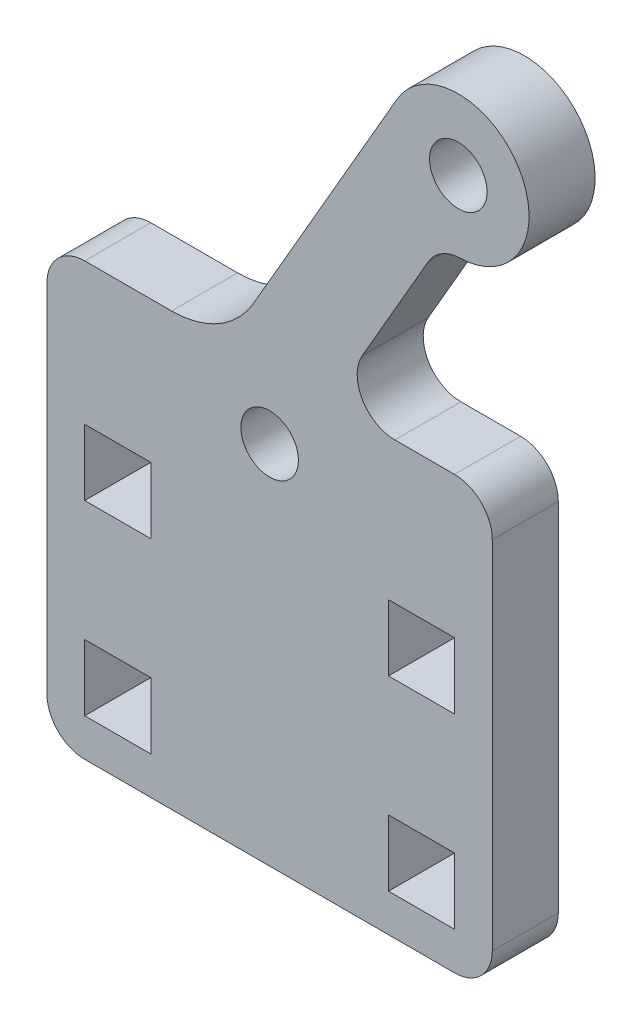
ISO-10303-21;
HEADER;
FILE_DESCRIPTION(('STEP AP214'),'2;1');
FILE_NAME('part.step','',(''),(''),'','','');
FILE_SCHEMA(('AUTOMOTIVE_DESIGN { 1 0 10303 214 1 1 1 1 }'));
ENDSEC;
DATA;
#1=APPLICATION_CONTEXT('core data for automotive mechanical design processes');
#2=APPLICATION_PROTOCOL_DEFINITION('international standard','automotive_design',2000,#1);
#3=PRODUCT_CONTEXT('',#1,'mechanical');
#4=PRODUCT('Part','Part','',(#3));
#5=PRODUCT_RELATED_PRODUCT_CATEGORY('part','',(#4));
#6=PRODUCT_DEFINITION_FORMATION('','',#4);
#7=PRODUCT_DEFINITION_CONTEXT('part definition',#1,'design');
#8=PRODUCT_DEFINITION('design','',#6,#7);
#9=PRODUCT_DEFINITION_SHAPE('','',#8);
#10=(LENGTH_UNIT() NAMED_UNIT(*) SI_UNIT(.MILLI.,.METRE.));
#11=(NAMED_UNIT(*) PLANE_ANGLE_UNIT() SI_UNIT($,.RADIAN.));
#12=(NAMED_UNIT(*) SI_UNIT($,.STERADIAN.) SOLID_ANGLE_UNIT());
#13=UNCERTAINTY_MEASURE_WITH_UNIT(LENGTH_MEASURE(1.E-05),#10,'distance_accuracy_value','');
#14=(GEOMETRIC_REPRESENTATION_CONTEXT(3) GLOBAL_UNCERTAINTY_ASSIGNED_CONTEXT((#13)) GLOBAL_UNIT_ASSIGNED_CONTEXT((#10,
#11,#12)) REPRESENTATION_CONTEXT('',''));
#15=CARTESIAN_POINT('',(0.,0.,0.));
#16=DIRECTION('',(0.,0.,1.));
#17=DIRECTION('',(1.,0.,0.));
#18=AXIS2_PLACEMENT_3D('',#15,#16,#17);
#19=CARTESIAN_POINT('',(10.,36.7005080756888,3.5));
#20=DIRECTION('',(0.,0.,1.));
#21=DIRECTION('',(1.,0.,0.));
#22=AXIS2_PLACEMENT_3D('',#19,#20,#21);
#23=PLANE('',#22);
#24=CARTESIAN_POINT('',(0.,19.38,3.5));
#25=DIRECTION('',(0.,0.,1.));
#26=DIRECTION('',(1.,0.,0.));
#27=AXIS2_PLACEMENT_3D('',#24,#25,#26);
#28=CIRCLE('',#27,1.525);
#29=CARTESIAN_POINT('',(1.525,19.38,3.5));
#30=VERTEX_POINT('',#29);
#31=EDGE_CURVE('E269',#30,#30,#28,.T.);
#32=ORIENTED_EDGE('',*,*,#31,.F.);
#33=EDGE_LOOP('',(#32));
#34=FACE_BOUND('',#33,.T.);
#35=DIRECTION('',(0.,-1.,0.));
#36=VECTOR('',#35,1.);
#37=CARTESIAN_POINT('',(-11.8,0.,3.5));
#38=LINE('',#37,#36);
#39=CARTESIAN_POINT('',(-11.8,20.88,3.5));
#40=VERTEX_POINT('',#39);
#41=CARTESIAN_POINT('',(-11.8,2.,3.5));
#42=VERTEX_POINT('',#41);
#43=EDGE_CURVE('E373',#40,#42,#38,.T.);
#44=ORIENTED_EDGE('',*,*,#43,.T.);
#45=CARTESIAN_POINT('',(-9.8,2.,3.5));
#46=DIRECTION('',(0.,0.,1.));
#47=DIRECTION('',(1.,0.,0.));
#48=AXIS2_PLACEMENT_3D('',#45,#46,#47);
#49=CIRCLE('',#48,2.);
#50=CARTESIAN_POINT('',(-9.8,0.,3.5));
#51=VERTEX_POINT('',#50);
#52=EDGE_CURVE('E442',#42,#51,#49,.T.);
#53=ORIENTED_EDGE('',*,*,#52,.T.);
#54=DIRECTION('',(1.,0.,0.));
#55=VECTOR('',#54,1.);
#56=CARTESIAN_POINT('',(-11.8,0.,3.5));
#57=LINE('',#56,#55);
#58=CARTESIAN_POINT('',(9.8,0.,3.5));
#59=VERTEX_POINT('',#58);
#60=EDGE_CURVE('E376',#51,#59,#57,.T.);
#61=ORIENTED_EDGE('',*,*,#60,.T.);
#62=CARTESIAN_POINT('',(9.8,2.,3.5));
#63=DIRECTION('',(0.,0.,1.));
#64=DIRECTION('',(1.,0.,0.));
#65=AXIS2_PLACEMENT_3D('',#62,#63,#64);
#66=CIRCLE('',#65,2.);
#67=CARTESIAN_POINT('',(11.8,2.,3.5));
#68=VERTEX_POINT('',#67);
#69=EDGE_CURVE('E438',#59,#68,#66,.T.);
#70=ORIENTED_EDGE('',*,*,#69,.T.);
#71=DIRECTION('',(0.,1.,0.));
#72=VECTOR('',#71,1.);
#73=CARTESIAN_POINT('',(11.8,0.,3.5));
#74=LINE('',#73,#72);
#75=CARTESIAN_POINT('',(11.8,20.88,3.5));
#76=VERTEX_POINT('',#75);
#77=EDGE_CURVE('E380',#68,#76,#74,.T.);
#78=ORIENTED_EDGE('',*,*,#77,.T.);
#79=CARTESIAN_POINT('',(9.8,20.88,3.5));
#80=DIRECTION('',(0.,0.,1.));
#81=DIRECTION('',(1.,0.,0.));
#82=AXIS2_PLACEMENT_3D('',#79,#80,#81);
#83=CIRCLE('',#82,2.);
#84=CARTESIAN_POINT('',(9.8,22.88,3.5));
#85=VERTEX_POINT('',#84);
#86=EDGE_CURVE('E436',#76,#85,#83,.T.);
#87=ORIENTED_EDGE('',*,*,#86,.T.);
#88=DIRECTION('',(-1.,0.,0.));
#89=VECTOR('',#88,1.);
#90=CARTESIAN_POINT('',(3.17542648054294,22.88,3.5));
#91=LINE('',#90,#89);
#92=CARTESIAN_POINT('',(6.6395280956807,22.88,3.5));
#93=VERTEX_POINT('',#92);
#94=EDGE_CURVE('E383',#85,#93,#91,.T.);
#95=ORIENTED_EDGE('',*,*,#94,.T.);
#96=CARTESIAN_POINT('',(6.6395280956807,24.88,3.5));
#97=DIRECTION('',(0.,0.,1.));
#98=DIRECTION('',(1.,0.,0.));
#99=AXIS2_PLACEMENT_3D('',#96,#97,#98);
#100=CIRCLE('',#99,2.);
#101=CARTESIAN_POINT('',(4.90747728811182,25.88,3.5));
#102=VERTEX_POINT('',#101);
#103=EDGE_CURVE('E467',#93,#102,#100,.F.);
#104=ORIENTED_EDGE('',*,*,#103,.T.);
#105=DIRECTION('',(0.5,0.866025403784439,0.));
#106=VECTOR('',#105,1.);
#107=CARTESIAN_POINT('',(9.05892136693432,33.0705120693016,3.5));
#108=LINE('',#107,#106);
#109=CARTESIAN_POINT('',(8.41334829499086,31.9523467086972,3.5));
#110=VERTEX_POINT('',#109);
#111=EDGE_CURVE('E386',#102,#110,#108,.T.);
#112=ORIENTED_EDGE('',*,*,#111,.T.);
#113=CARTESIAN_POINT('',(10.1453991025597,30.9523467086972,3.5));
#114=DIRECTION('',(0.,0.,1.));
#115=DIRECTION('',(1.,0.,0.));
#116=AXIS2_PLACEMENT_3D('',#113,#114,#115);
#117=CIRCLE('',#116,2.);
#118=CARTESIAN_POINT('',(10.0948255016694,32.9517071841725,3.5));
#119=VERTEX_POINT('',#118);
#120=EDGE_CURVE('E471',#110,#119,#117,.F.);
#121=ORIENTED_EDGE('',*,*,#120,.T.);
#122=CARTESIAN_POINT('',(10.,36.7005080756888,3.5));
#123=DIRECTION('',(0.,0.,1.));
#124=DIRECTION('',(1.,0.,0.));
#125=AXIS2_PLACEMENT_3D('',#122,#123,#124);
#126=CIRCLE('',#125,3.75);
#127=CARTESIAN_POINT('',(6.75240473580835,38.5755080756888,3.5));
#128=VERTEX_POINT('',#127);
#129=EDGE_CURVE('E389',#119,#128,#126,.T.);
#130=ORIENTED_EDGE('',*,*,#129,.T.);
#131=DIRECTION('',(-0.5,-0.866025403784439,0.));
#132=VECTOR('',#131,1.);
#133=CARTESIAN_POINT('',(-2.30940107675851,22.88,3.5));
#134=LINE('',#133,#132);
#135=CARTESIAN_POINT('',(-0.86602540378444,25.38,3.5));
#136=VERTEX_POINT('',#135);
#137=EDGE_CURVE('E391',#128,#136,#134,.T.);
#138=ORIENTED_EDGE('',*,*,#137,.T.);
#139=CARTESIAN_POINT('',(-5.19615242270663,27.88,3.5));
#140=DIRECTION('',(0.,0.,1.));
#141=DIRECTION('',(1.,0.,0.));
#142=AXIS2_PLACEMENT_3D('',#139,#140,#141);
#143=CIRCLE('',#142,5.);
#144=CARTESIAN_POINT('',(-5.19615242270663,22.88,3.5));
#145=VERTEX_POINT('',#144);
#146=EDGE_CURVE('E11',#136,#145,#143,.F.);
#147=ORIENTED_EDGE('',*,*,#146,.T.);
#148=DIRECTION('',(-1.,0.,0.));
#149=VECTOR('',#148,1.);
#150=CARTESIAN_POINT('',(-11.8,22.88,3.5));
#151=LINE('',#150,#149);
#152=CARTESIAN_POINT('',(-9.8,22.88,3.5));
#153=VERTEX_POINT('',#152);
#154=EDGE_CURVE('E393',#145,#153,#151,.T.);
#155=ORIENTED_EDGE('',*,*,#154,.T.);
#156=CARTESIAN_POINT('',(-9.8,20.88,3.5));
#157=DIRECTION('',(0.,0.,1.));
#158=DIRECTION('',(1.,0.,0.));
#159=AXIS2_PLACEMENT_3D('',#156,#157,#158);
#160=CIRCLE('',#159,2.);
#161=EDGE_CURVE('E440',#153,#40,#160,.T.);
#162=ORIENTED_EDGE('',*,*,#161,.T.);
#163=EDGE_LOOP('',(#44,#53,#61,#70,#78,#87,#95,#104,#112,#121,#130,#138,#147,#155,#162));
#164=FACE_BOUND('',#163,.T.);
#165=DIRECTION('',(1.,0.,0.));
#166=VECTOR('',#165,1.);
#167=CARTESIAN_POINT('',(-9.8,2.,3.5));
#168=LINE('',#167,#166);
#169=CARTESIAN_POINT('',(-9.8,2.,3.5));
#170=VERTEX_POINT('',#169);
#171=CARTESIAN_POINT('',(-6.3,2.,3.5));
#172=VERTEX_POINT('',#171);
#173=EDGE_CURVE('E344',#170,#172,#168,.T.);
#174=ORIENTED_EDGE('',*,*,#173,.F.);
#175=DIRECTION('',(0.,-1.,0.));
#176=VECTOR('',#175,1.);
#177=CARTESIAN_POINT('',(-9.8,2.,3.5));
#178=LINE('',#177,#176);
#179=CARTESIAN_POINT('',(-9.8,5.5,3.5));
#180=VERTEX_POINT('',#179);
#181=EDGE_CURVE('E342',#180,#170,#178,.T.);
#182=ORIENTED_EDGE('',*,*,#181,.F.);
#183=DIRECTION('',(-1.,0.,0.));
#184=VECTOR('',#183,1.);
#185=CARTESIAN_POINT('',(-9.8,5.5,3.5));
#186=LINE('',#185,#184);
#187=CARTESIAN_POINT('',(-6.3,5.5,3.5));
#188=VERTEX_POINT('',#187);
#189=EDGE_CURVE('E350',#188,#180,#186,.T.);
#190=ORIENTED_EDGE('',*,*,#189,.F.);
#191=DIRECTION('',(0.,1.,0.));
#192=VECTOR('',#191,1.);
#193=CARTESIAN_POINT('',(-6.3,2.,3.5));
#194=LINE('',#193,#192);
#195=EDGE_CURVE('E347',#172,#188,#194,.T.);
#196=ORIENTED_EDGE('',*,*,#195,.F.);
#197=EDGE_LOOP('',(#174,#182,#190,#196));
#198=FACE_BOUND('',#197,.T.);
#199=DIRECTION('',(1.,0.,0.));
#200=VECTOR('',#199,1.);
#201=CARTESIAN_POINT('',(6.3,2.,3.5));
#202=LINE('',#201,#200);
#203=CARTESIAN_POINT('',(6.3,2.,3.5));
#204=VERTEX_POINT('',#203);
#205=CARTESIAN_POINT('',(9.8,2.,3.5));
#206=VERTEX_POINT('',#205);
#207=EDGE_CURVE('E313',#204,#206,#202,.T.);
#208=ORIENTED_EDGE('',*,*,#207,.F.);
#209=DIRECTION('',(0.,-1.,0.));
#210=VECTOR('',#209,1.);
#211=CARTESIAN_POINT('',(6.3,2.,3.5));
#212=LINE('',#211,#210);
#213=CARTESIAN_POINT('',(6.3,5.5,3.5));
#214=VERTEX_POINT('',#213);
#215=EDGE_CURVE('E311',#214,#204,#212,.T.);
#216=ORIENTED_EDGE('',*,*,#215,.F.);
#217=DIRECTION('',(-1.,0.,0.));
#218=VECTOR('',#217,1.);
#219=CARTESIAN_POINT('',(6.3,5.5,3.5));
#220=LINE('',#219,#218);
#221=CARTESIAN_POINT('',(9.8,5.5,3.5));
#222=VERTEX_POINT('',#221);
#223=EDGE_CURVE('E319',#222,#214,#220,.T.);
#224=ORIENTED_EDGE('',*,*,#223,.F.);
#225=DIRECTION('',(0.,1.,0.));
#226=VECTOR('',#225,1.);
#227=CARTESIAN_POINT('',(9.8,2.,3.5));
#228=LINE('',#227,#226);
#229=EDGE_CURVE('E316',#206,#222,#228,.T.);
#230=ORIENTED_EDGE('',*,*,#229,.F.);
#231=EDGE_LOOP('',(#208,#216,#224,#230));
#232=FACE_BOUND('',#231,.T.);
#233=DIRECTION('',(0.,-1.,0.));
#234=VECTOR('',#233,1.);
#235=CARTESIAN_POINT('',(6.3,15.38,3.5));
#236=LINE('',#235,#234);
#237=CARTESIAN_POINT('',(6.3,15.38,3.5));
#238=VERTEX_POINT('',#237);
#239=CARTESIAN_POINT('',(6.3,11.88,3.5));
#240=VERTEX_POINT('',#239);
#241=EDGE_CURVE('E282',#238,#240,#236,.T.);
#242=ORIENTED_EDGE('',*,*,#241,.F.);
#243=DIRECTION('',(-1.,0.,0.));
#244=VECTOR('',#243,1.);
#245=CARTESIAN_POINT('',(6.3,15.38,3.5));
#246=LINE('',#245,#244);
#247=CARTESIAN_POINT('',(9.8,15.38,3.5));
#248=VERTEX_POINT('',#247);
#249=EDGE_CURVE('E280',#248,#238,#246,.T.);
#250=ORIENTED_EDGE('',*,*,#249,.F.);
#251=DIRECTION('',(0.,1.,0.));
#252=VECTOR('',#251,1.);
#253=CARTESIAN_POINT('',(9.8,15.38,3.5));
#254=LINE('',#253,#252);
#255=CARTESIAN_POINT('',(9.8,11.88,3.5));
#256=VERTEX_POINT('',#255);
#257=EDGE_CURVE('E288',#256,#248,#254,.T.);
#258=ORIENTED_EDGE('',*,*,#257,.F.);
#259=DIRECTION('',(1.,0.,0.));
#260=VECTOR('',#259,1.);
#261=CARTESIAN_POINT('',(6.3,11.88,3.5));
#262=LINE('',#261,#260);
#263=EDGE_CURVE('E285',#240,#256,#262,.T.);
#264=ORIENTED_EDGE('',*,*,#263,.F.);
#265=EDGE_LOOP('',(#242,#250,#258,#264));
#266=FACE_BOUND('',#265,.T.);
#267=DIRECTION('',(1.,0.,0.));
#268=VECTOR('',#267,1.);
#269=CARTESIAN_POINT('',(-9.8,11.88,3.5));
#270=LINE('',#269,#268);
#271=CARTESIAN_POINT('',(-9.8,11.88,3.5));
#272=VERTEX_POINT('',#271);
#273=CARTESIAN_POINT('',(-6.3,11.88,3.5));
#274=VERTEX_POINT('',#273);
#275=EDGE_CURVE('E246',#272,#274,#270,.T.);
#276=ORIENTED_EDGE('',*,*,#275,.F.);
#277=DIRECTION('',(0.,-1.,0.));
#278=VECTOR('',#277,1.);
#279=CARTESIAN_POINT('',(-9.8,15.38,3.5));
#280=LINE('',#279,#278);
#281=CARTESIAN_POINT('',(-9.8,15.38,3.5));
#282=VERTEX_POINT('',#281);
#283=EDGE_CURVE('E236',#282,#272,#280,.T.);
#284=ORIENTED_EDGE('',*,*,#283,.F.);
#285=DIRECTION('',(-1.,0.,0.));
#286=VECTOR('',#285,1.);
#287=CARTESIAN_POINT('',(-9.8,15.38,3.5));
#288=LINE('',#287,#286);
#289=CARTESIAN_POINT('',(-6.3,15.38,3.5));
#290=VERTEX_POINT('',#289);
#291=EDGE_CURVE('E262',#290,#282,#288,.T.);
#292=ORIENTED_EDGE('',*,*,#291,.F.);
#293=DIRECTION('',(0.,1.,0.));
#294=VECTOR('',#293,1.);
#295=CARTESIAN_POINT('',(-6.3,15.38,3.5));
#296=LINE('',#295,#294);
#297=EDGE_CURVE('E260',#274,#290,#296,.T.);
#298=ORIENTED_EDGE('',*,*,#297,.F.);
#299=EDGE_LOOP('',(#276,#284,#292,#298));
#300=FACE_BOUND('',#299,.T.);
#301=CARTESIAN_POINT('',(10.,36.7005080756888,3.5));
#302=DIRECTION('',(0.,0.,1.));
#303=DIRECTION('',(1.,0.,0.));
#304=AXIS2_PLACEMENT_3D('',#301,#302,#303);
#305=CIRCLE('',#304,1.525);
#306=CARTESIAN_POINT('',(11.525,36.7005080756888,3.5));
#307=VERTEX_POINT('',#306);
#308=EDGE_CURVE('E858',#307,#307,#305,.T.);
#309=ORIENTED_EDGE('',*,*,#308,.F.);
#310=EDGE_LOOP('',(#309));
#311=FACE_BOUND('',#310,.T.);
#312=ADVANCED_FACE('F32',(#34,#164,#198,#232,#266,#300,#311),#23,.T.);
#313=CARTESIAN_POINT('',(10.,36.7005080756888,0.));
#314=DIRECTION('',(0.,0.,1.));
#315=DIRECTION('',(1.,0.,0.));
#316=AXIS2_PLACEMENT_3D('',#313,#314,#315);
#317=PLANE('',#316);
#318=DIRECTION('',(-1.,0.,0.));
#319=VECTOR('',#318,1.);
#320=CARTESIAN_POINT('',(6.3,15.38,0.));
#321=LINE('',#320,#319);
#322=CARTESIAN_POINT('',(9.8,15.38,0.));
#323=VERTEX_POINT('',#322);
#324=CARTESIAN_POINT('',(6.3,15.38,0.));
#325=VERTEX_POINT('',#324);
#326=EDGE_CURVE('E254',#323,#325,#321,.T.);
#327=ORIENTED_EDGE('',*,*,#326,.T.);
#328=DIRECTION('',(0.,-1.,0.));
#329=VECTOR('',#328,1.);
#330=CARTESIAN_POINT('',(6.3,15.38,0.));
#331=LINE('',#330,#329);
#332=CARTESIAN_POINT('',(6.3,11.88,0.));
#333=VERTEX_POINT('',#332);
#334=EDGE_CURVE('E293',#325,#333,#331,.T.);
#335=ORIENTED_EDGE('',*,*,#334,.T.);
#336=DIRECTION('',(1.,0.,0.));
#337=VECTOR('',#336,1.);
#338=CARTESIAN_POINT('',(6.3,11.88,0.));
#339=LINE('',#338,#337);
#340=CARTESIAN_POINT('',(9.8,11.88,0.));
#341=VERTEX_POINT('',#340);
#342=EDGE_CURVE('E296',#333,#341,#339,.T.);
#343=ORIENTED_EDGE('',*,*,#342,.T.);
#344=DIRECTION('',(0.,1.,0.));
#345=VECTOR('',#344,1.);
#346=CARTESIAN_POINT('',(9.8,15.38,0.));
#347=LINE('',#346,#345);
#348=EDGE_CURVE('E283',#341,#323,#347,.T.);
#349=ORIENTED_EDGE('',*,*,#348,.T.);
#350=EDGE_LOOP('',(#327,#335,#343,#349));
#351=FACE_BOUND('',#350,.T.);
#352=DIRECTION('',(0.,-1.,0.));
#353=VECTOR('',#352,1.);
#354=CARTESIAN_POINT('',(-9.8,2.,0.));
#355=LINE('',#354,#353);
#356=CARTESIAN_POINT('',(-9.8,5.5,0.));
#357=VERTEX_POINT('',#356);
#358=CARTESIAN_POINT('',(-9.8,2.,0.));
#359=VERTEX_POINT('',#358);
#360=EDGE_CURVE('E341',#357,#359,#355,.T.);
#361=ORIENTED_EDGE('',*,*,#360,.T.);
#362=DIRECTION('',(1.,0.,0.));
#363=VECTOR('',#362,1.);
#364=CARTESIAN_POINT('',(-9.8,2.,0.));
#365=LINE('',#364,#363);
#366=CARTESIAN_POINT('',(-6.3,2.,0.));
#367=VERTEX_POINT('',#366);
#368=EDGE_CURVE('E355',#359,#367,#365,.T.);
#369=ORIENTED_EDGE('',*,*,#368,.T.);
#370=DIRECTION('',(0.,1.,0.));
#371=VECTOR('',#370,1.);
#372=CARTESIAN_POINT('',(-6.3,2.,0.));
#373=LINE('',#372,#371);
#374=CARTESIAN_POINT('',(-6.3,5.5,0.));
#375=VERTEX_POINT('',#374);
#376=EDGE_CURVE('E358',#367,#375,#373,.T.);
#377=ORIENTED_EDGE('',*,*,#376,.T.);
#378=DIRECTION('',(-1.,0.,0.));
#379=VECTOR('',#378,1.);
#380=CARTESIAN_POINT('',(-9.8,5.5,0.));
#381=LINE('',#380,#379);
#382=EDGE_CURVE('E345',#375,#357,#381,.T.);
#383=ORIENTED_EDGE('',*,*,#382,.T.);
#384=EDGE_LOOP('',(#361,#369,#377,#383));
#385=FACE_BOUND('',#384,.T.);
#386=DIRECTION('',(1.,0.,0.));
#387=VECTOR('',#386,1.);
#388=CARTESIAN_POINT('',(-11.8,0.,0.));
#389=LINE('',#388,#387);
#390=CARTESIAN_POINT('',(-9.8,0.,0.));
#391=VERTEX_POINT('',#390);
#392=CARTESIAN_POINT('',(9.8,0.,0.));
#393=VERTEX_POINT('',#392);
#394=EDGE_CURVE('E398',#391,#393,#389,.T.);
#395=ORIENTED_EDGE('',*,*,#394,.F.);
#396=CARTESIAN_POINT('',(-9.8,2.,0.));
#397=DIRECTION('',(0.,0.,1.));
#398=DIRECTION('',(1.,0.,0.));
#399=AXIS2_PLACEMENT_3D('',#396,#397,#398);
#400=CIRCLE('',#399,2.);
#401=CARTESIAN_POINT('',(-11.8,2.,0.));
#402=VERTEX_POINT('',#401);
#403=EDGE_CURVE('E429',#391,#402,#400,.F.);
#404=ORIENTED_EDGE('',*,*,#403,.T.);
#405=DIRECTION('',(0.,-1.,0.));
#406=VECTOR('',#405,1.);
#407=CARTESIAN_POINT('',(-11.8,0.,0.));
#408=LINE('',#407,#406);
#409=CARTESIAN_POINT('',(-11.8,20.88,0.));
#410=VERTEX_POINT('',#409);
#411=EDGE_CURVE('E372',#410,#402,#408,.T.);
#412=ORIENTED_EDGE('',*,*,#411,.F.);
#413=CARTESIAN_POINT('',(-9.8,20.88,0.));
#414=DIRECTION('',(0.,0.,1.));
#415=DIRECTION('',(1.,0.,0.));
#416=AXIS2_PLACEMENT_3D('',#413,#414,#415);
#417=CIRCLE('',#416,2.);
#418=CARTESIAN_POINT('',(-9.8,22.88,0.));
#419=VERTEX_POINT('',#418);
#420=EDGE_CURVE('E426',#410,#419,#417,.F.);
#421=ORIENTED_EDGE('',*,*,#420,.T.);
#422=DIRECTION('',(-1.,0.,0.));
#423=VECTOR('',#422,1.);
#424=CARTESIAN_POINT('',(-11.8,22.88,0.));
#425=LINE('',#424,#423);
#426=CARTESIAN_POINT('',(-5.19615242270663,22.88,0.));
#427=VERTEX_POINT('',#426);
#428=EDGE_CURVE('E377',#427,#419,#425,.T.);
#429=ORIENTED_EDGE('',*,*,#428,.F.);
#430=CARTESIAN_POINT('',(-5.19615242270663,27.88,0.));
#431=DIRECTION('',(0.,0.,1.));
#432=DIRECTION('',(1.,0.,0.));
#433=AXIS2_PLACEMENT_3D('',#430,#431,#432);
#434=CIRCLE('',#433,5.);
#435=CARTESIAN_POINT('',(-0.86602540378444,25.38,0.));
#436=VERTEX_POINT('',#435);
#437=EDGE_CURVE('E40',#427,#436,#434,.T.);
#438=ORIENTED_EDGE('',*,*,#437,.T.);
#439=DIRECTION('',(-0.5,-0.866025403784439,0.));
#440=VECTOR('',#439,1.);
#441=CARTESIAN_POINT('',(-2.30940107675851,22.88,0.));
#442=LINE('',#441,#440);
#443=CARTESIAN_POINT('',(6.75240473580835,38.5755080756888,0.));
#444=VERTEX_POINT('',#443);
#445=EDGE_CURVE('E412',#444,#436,#442,.T.);
#446=ORIENTED_EDGE('',*,*,#445,.F.);
#447=CARTESIAN_POINT('',(10.,36.7005080756888,0.));
#448=DIRECTION('',(0.,0.,1.));
#449=DIRECTION('',(1.,0.,0.));
#450=AXIS2_PLACEMENT_3D('',#447,#448,#449);
#451=CIRCLE('',#450,3.75);
#452=CARTESIAN_POINT('',(10.0948255016694,32.9517071841725,0.));
#453=VERTEX_POINT('',#452);
#454=EDGE_CURVE('E410',#453,#444,#451,.T.);
#455=ORIENTED_EDGE('',*,*,#454,.F.);
#456=CARTESIAN_POINT('',(10.1453991025597,30.9523467086972,0.));
#457=DIRECTION('',(0.,0.,1.));
#458=DIRECTION('',(1.,0.,0.));
#459=AXIS2_PLACEMENT_3D('',#456,#457,#458);
#460=CIRCLE('',#459,2.);
#461=CARTESIAN_POINT('',(8.41334829499086,31.9523467086972,0.));
#462=VERTEX_POINT('',#461);
#463=EDGE_CURVE('E469',#453,#462,#460,.T.);
#464=ORIENTED_EDGE('',*,*,#463,.T.);
#465=DIRECTION('',(0.5,0.866025403784439,0.));
#466=VECTOR('',#465,1.);
#467=CARTESIAN_POINT('',(9.05892136693432,33.0705120693016,0.));
#468=LINE('',#467,#466);
#469=CARTESIAN_POINT('',(4.90747728811182,25.88,0.));
#470=VERTEX_POINT('',#469);
#471=EDGE_CURVE('E407',#470,#462,#468,.T.);
#472=ORIENTED_EDGE('',*,*,#471,.F.);
#473=CARTESIAN_POINT('',(6.6395280956807,24.88,0.));
#474=DIRECTION('',(0.,0.,1.));
#475=DIRECTION('',(1.,0.,0.));
#476=AXIS2_PLACEMENT_3D('',#473,#474,#475);
#477=CIRCLE('',#476,2.);
#478=CARTESIAN_POINT('',(6.6395280956807,22.88,0.));
#479=VERTEX_POINT('',#478);
#480=EDGE_CURVE('E465',#470,#479,#477,.T.);
#481=ORIENTED_EDGE('',*,*,#480,.T.);
#482=DIRECTION('',(-1.,0.,0.));
#483=VECTOR('',#482,1.);
#484=CARTESIAN_POINT('',(3.17542648054294,22.88,0.));
#485=LINE('',#484,#483);
#486=CARTESIAN_POINT('',(9.8,22.88,0.));
#487=VERTEX_POINT('',#486);
#488=EDGE_CURVE('E404',#487,#479,#485,.T.);
#489=ORIENTED_EDGE('',*,*,#488,.F.);
#490=CARTESIAN_POINT('',(9.8,20.88,0.));
#491=DIRECTION('',(0.,0.,1.));
#492=DIRECTION('',(1.,0.,0.));
#493=AXIS2_PLACEMENT_3D('',#490,#491,#492);
#494=CIRCLE('',#493,2.);
#495=CARTESIAN_POINT('',(11.8,20.88,0.));
#496=VERTEX_POINT('',#495);
#497=EDGE_CURVE('E422',#487,#496,#494,.F.);
#498=ORIENTED_EDGE('',*,*,#497,.T.);
#499=DIRECTION('',(0.,1.,0.));
#500=VECTOR('',#499,1.);
#501=CARTESIAN_POINT('',(11.8,0.,0.));
#502=LINE('',#501,#500);
#503=CARTESIAN_POINT('',(11.8,2.,0.));
#504=VERTEX_POINT('',#503);
#505=EDGE_CURVE('E401',#504,#496,#502,.T.);
#506=ORIENTED_EDGE('',*,*,#505,.F.);
#507=CARTESIAN_POINT('',(9.8,2.,0.));
#508=DIRECTION('',(0.,0.,1.));
#509=DIRECTION('',(1.,0.,0.));
#510=AXIS2_PLACEMENT_3D('',#507,#508,#509);
#511=CIRCLE('',#510,2.);
#512=EDGE_CURVE('E424',#504,#393,#511,.F.);
#513=ORIENTED_EDGE('',*,*,#512,.T.);
#514=EDGE_LOOP('',(#395,#404,#412,#421,#429,#438,#446,#455,#464,#472,#481,#489,#498,#506,#513));
#515=FACE_BOUND('',#514,.T.);
#516=DIRECTION('',(0.,-1.,0.));
#517=VECTOR('',#516,1.);
#518=CARTESIAN_POINT('',(6.3,2.,0.));
#519=LINE('',#518,#517);
#520=CARTESIAN_POINT('',(6.3,5.5,0.));
#521=VERTEX_POINT('',#520);
#522=CARTESIAN_POINT('',(6.3,2.,0.));
#523=VERTEX_POINT('',#522);
#524=EDGE_CURVE('E310',#521,#523,#519,.T.);
#525=ORIENTED_EDGE('',*,*,#524,.T.);
#526=DIRECTION('',(1.,0.,0.));
#527=VECTOR('',#526,1.);
#528=CARTESIAN_POINT('',(6.3,2.,0.));
#529=LINE('',#528,#527);
#530=CARTESIAN_POINT('',(9.8,2.,0.));
#531=VERTEX_POINT('',#530);
#532=EDGE_CURVE('E324',#523,#531,#529,.T.);
#533=ORIENTED_EDGE('',*,*,#532,.T.);
#534=DIRECTION('',(0.,1.,0.));
#535=VECTOR('',#534,1.);
#536=CARTESIAN_POINT('',(9.8,2.,0.));
#537=LINE('',#536,#535);
#538=CARTESIAN_POINT('',(9.8,5.5,0.));
#539=VERTEX_POINT('',#538);
#540=EDGE_CURVE('E327',#531,#539,#537,.T.);
#541=ORIENTED_EDGE('',*,*,#540,.T.);
#542=DIRECTION('',(-1.,0.,0.));
#543=VECTOR('',#542,1.);
#544=CARTESIAN_POINT('',(6.3,5.5,0.));
#545=LINE('',#544,#543);
#546=EDGE_CURVE('E314',#539,#521,#545,.T.);
#547=ORIENTED_EDGE('',*,*,#546,.T.);
#548=EDGE_LOOP('',(#525,#533,#541,#547));
#549=FACE_BOUND('',#548,.T.);
#550=DIRECTION('',(0.,-1.,0.));
#551=VECTOR('',#550,1.);
#552=CARTESIAN_POINT('',(-9.8,15.38,0.));
#553=LINE('',#552,#551);
#554=CARTESIAN_POINT('',(-9.8,15.38,0.));
#555=VERTEX_POINT('',#554);
#556=CARTESIAN_POINT('',(-9.8,11.88,0.));
#557=VERTEX_POINT('',#556);
#558=EDGE_CURVE('E267',#555,#557,#553,.T.);
#559=ORIENTED_EDGE('',*,*,#558,.T.);
#560=DIRECTION('',(1.,0.,0.));
#561=VECTOR('',#560,1.);
#562=CARTESIAN_POINT('',(-9.8,11.88,0.));
#563=LINE('',#562,#561);
#564=CARTESIAN_POINT('',(-6.3,11.88,0.));
#565=VERTEX_POINT('',#564);
#566=EDGE_CURVE('E253',#557,#565,#563,.T.);
#567=ORIENTED_EDGE('',*,*,#566,.T.);
#568=DIRECTION('',(0.,1.,0.));
#569=VECTOR('',#568,1.);
#570=CARTESIAN_POINT('',(-6.3,15.38,0.));
#571=LINE('',#570,#569);
#572=CARTESIAN_POINT('',(-6.3,15.38,0.));
#573=VERTEX_POINT('',#572);
#574=EDGE_CURVE('E271',#565,#573,#571,.T.);
#575=ORIENTED_EDGE('',*,*,#574,.T.);
#576=DIRECTION('',(-1.,0.,0.));
#577=VECTOR('',#576,1.);
#578=CARTESIAN_POINT('',(-9.8,15.38,0.));
#579=LINE('',#578,#577);
#580=EDGE_CURVE('E247',#573,#555,#579,.T.);
#581=ORIENTED_EDGE('',*,*,#580,.T.);
#582=EDGE_LOOP('',(#559,#567,#575,#581));
#583=FACE_BOUND('',#582,.T.);
#584=CARTESIAN_POINT('',(0.,19.38,0.));
#585=DIRECTION('',(0.,0.,1.));
#586=DIRECTION('',(1.,0.,0.));
#587=AXIS2_PLACEMENT_3D('',#584,#585,#586);
#588=CIRCLE('',#587,1.525);
#589=CARTESIAN_POINT('',(1.525,19.38,0.));
#590=VERTEX_POINT('',#589);
#591=EDGE_CURVE('E864',#590,#590,#588,.T.);
#592=ORIENTED_EDGE('',*,*,#591,.T.);
#593=EDGE_LOOP('',(#592));
#594=FACE_BOUND('',#593,.T.);
#595=CARTESIAN_POINT('',(10.,36.7005080756888,0.));
#596=DIRECTION('',(0.,0.,1.));
#597=DIRECTION('',(1.,0.,0.));
#598=AXIS2_PLACEMENT_3D('',#595,#596,#597);
#599=CIRCLE('',#598,1.525);
#600=CARTESIAN_POINT('',(11.525,36.7005080756888,0.));
#601=VERTEX_POINT('',#600);
#602=EDGE_CURVE('E861',#601,#601,#599,.T.);
#603=ORIENTED_EDGE('',*,*,#602,.T.);
#604=EDGE_LOOP('',(#603));
#605=FACE_BOUND('',#604,.T.);
#606=ADVANCED_FACE('F483',(#351,#385,#515,#549,#583,#594,#605),#317,.F.);
#607=CARTESIAN_POINT('',(-11.8,0.,3.5));
#608=DIRECTION('',(1.,0.,0.));
#609=DIRECTION('',(0.,0.,-1.));
#610=AXIS2_PLACEMENT_3D('',#607,#608,#609);
#611=PLANE('',#610);
#612=ORIENTED_EDGE('',*,*,#411,.T.);
#613=DIRECTION('',(0.,0.,-1.));
#614=VECTOR('',#613,1.);
#615=CARTESIAN_POINT('',(-11.8,2.,3.5));
#616=LINE('',#615,#614);
#617=EDGE_CURVE('E434',#402,#42,#616,.F.);
#618=ORIENTED_EDGE('',*,*,#617,.T.);
#619=ORIENTED_EDGE('',*,*,#43,.F.);
#620=DIRECTION('',(0.,0.,-1.));
#621=VECTOR('',#620,1.);
#622=CARTESIAN_POINT('',(-11.8,20.88,3.5));
#623=LINE('',#622,#621);
#624=EDGE_CURVE('E431',#40,#410,#623,.T.);
#625=ORIENTED_EDGE('',*,*,#624,.T.);
#626=EDGE_LOOP('',(#612,#618,#619,#625));
#627=FACE_BOUND('',#626,.T.);
#628=ADVANCED_FACE('F496',(#627),#611,.F.);
#629=CARTESIAN_POINT('',(-11.8,0.,3.5));
#630=DIRECTION('',(0.,1.,0.));
#631=DIRECTION('',(0.,0.,1.));
#632=AXIS2_PLACEMENT_3D('',#629,#630,#631);
#633=PLANE('',#632);
#634=ORIENTED_EDGE('',*,*,#60,.F.);
#635=DIRECTION('',(0.,0.,-1.));
#636=VECTOR('',#635,1.);
#637=CARTESIAN_POINT('',(-9.8,0.,3.5));
#638=LINE('',#637,#636);
#639=EDGE_CURVE('E419',#51,#391,#638,.T.);
#640=ORIENTED_EDGE('',*,*,#639,.T.);
#641=ORIENTED_EDGE('',*,*,#394,.T.);
#642=DIRECTION('',(0.,0.,-1.));
#643=VECTOR('',#642,1.);
#644=CARTESIAN_POINT('',(9.8,0.,3.5));
#645=LINE('',#644,#643);
#646=EDGE_CURVE('E417',#393,#59,#645,.F.);
#647=ORIENTED_EDGE('',*,*,#646,.T.);
#648=EDGE_LOOP('',(#634,#640,#641,#647));
#649=FACE_BOUND('',#648,.T.);
#650=ADVANCED_FACE('F504',(#649),#633,.F.);
#651=CARTESIAN_POINT('',(11.8,0.,3.5));
#652=DIRECTION('',(-1.,0.,0.));
#653=DIRECTION('',(0.,0.,1.));
#654=AXIS2_PLACEMENT_3D('',#651,#652,#653);
#655=PLANE('',#654);
#656=ORIENTED_EDGE('',*,*,#77,.F.);
#657=DIRECTION('',(0.,0.,-1.));
#658=VECTOR('',#657,1.);
#659=CARTESIAN_POINT('',(11.8,2.,3.5));
#660=LINE('',#659,#658);
#661=EDGE_CURVE('E449',#68,#504,#660,.T.);
#662=ORIENTED_EDGE('',*,*,#661,.T.);
#663=ORIENTED_EDGE('',*,*,#505,.T.);
#664=DIRECTION('',(0.,0.,-1.));
#665=VECTOR('',#664,1.);
#666=CARTESIAN_POINT('',(11.8,20.88,3.5));
#667=LINE('',#666,#665);
#668=EDGE_CURVE('E447',#496,#76,#667,.F.);
#669=ORIENTED_EDGE('',*,*,#668,.T.);
#670=EDGE_LOOP('',(#656,#662,#663,#669));
#671=FACE_BOUND('',#670,.T.);
#672=ADVANCED_FACE('F512',(#671),#655,.F.);
#673=CARTESIAN_POINT('',(3.17542648054294,22.88,3.5));
#674=DIRECTION('',(0.,-1.,0.));
#675=DIRECTION('',(0.,0.,-1.));
#676=AXIS2_PLACEMENT_3D('',#673,#674,#675);
#677=PLANE('',#676);
#678=ORIENTED_EDGE('',*,*,#488,.T.);
#679=DIRECTION('',(0.,0.,-1.));
#680=VECTOR('',#679,1.);
#681=CARTESIAN_POINT('',(6.6395280956807,22.88,3.5));
#682=LINE('',#681,#680);
#683=EDGE_CURVE('E460',#479,#93,#682,.F.);
#684=ORIENTED_EDGE('',*,*,#683,.T.);
#685=ORIENTED_EDGE('',*,*,#94,.F.);
#686=DIRECTION('',(0.,0.,-1.));
#687=VECTOR('',#686,1.);
#688=CARTESIAN_POINT('',(9.8,22.88,3.5));
#689=LINE('',#688,#687);
#690=EDGE_CURVE('E452',#85,#487,#689,.T.);
#691=ORIENTED_EDGE('',*,*,#690,.T.);
#692=EDGE_LOOP('',(#678,#684,#685,#691));
#693=FACE_BOUND('',#692,.T.);
#694=ADVANCED_FACE('F521',(#693),#677,.F.);
#695=CARTESIAN_POINT('',(9.05892136693432,33.0705120693016,3.5));
#696=DIRECTION('',(-0.866025403784439,0.5,0.));
#697=DIRECTION('',(-0.5,-0.866025403784439,0.));
#698=AXIS2_PLACEMENT_3D('',#695,#696,#697);
#699=PLANE('',#698);
#700=ORIENTED_EDGE('',*,*,#111,.F.);
#701=DIRECTION('',(0.,0.,-1.));
#702=VECTOR('',#701,1.);
#703=CARTESIAN_POINT('',(4.90747728811182,25.88,0.));
#704=LINE('',#703,#702);
#705=EDGE_CURVE('E457',#102,#470,#704,.T.);
#706=ORIENTED_EDGE('',*,*,#705,.T.);
#707=ORIENTED_EDGE('',*,*,#471,.T.);
#708=DIRECTION('',(0.,0.,1.));
#709=VECTOR('',#708,1.);
#710=CARTESIAN_POINT('',(8.41334829499086,31.9523467086972,3.5));
#711=LINE('',#710,#709);
#712=EDGE_CURVE('E455',#462,#110,#711,.T.);
#713=ORIENTED_EDGE('',*,*,#712,.T.);
#714=EDGE_LOOP('',(#700,#706,#707,#713));
#715=FACE_BOUND('',#714,.T.);
#716=ADVANCED_FACE('F530',(#715),#699,.F.);
#717=CARTESIAN_POINT('',(10.,36.7005080756888,3.5));
#718=DIRECTION('',(0.,0.,-1.));
#719=DIRECTION('',(-1.,0.,0.));
#720=AXIS2_PLACEMENT_3D('',#717,#718,#719);
#721=CYLINDRICAL_SURFACE('',#720,3.75);
#722=ORIENTED_EDGE('',*,*,#129,.F.);
#723=DIRECTION('',(0.,0.,-1.));
#724=VECTOR('',#723,1.);
#725=CARTESIAN_POINT('',(10.0948255016694,32.9517071841725,3.5));
#726=LINE('',#725,#724);
#727=EDGE_CURVE('E462',#119,#453,#726,.T.);
#728=ORIENTED_EDGE('',*,*,#727,.T.);
#729=ORIENTED_EDGE('',*,*,#454,.T.);
#730=DIRECTION('',(0.,0.,-1.));
#731=VECTOR('',#730,1.);
#732=CARTESIAN_POINT('',(6.75240473580835,38.5755080756888,3.5));
#733=LINE('',#732,#731);
#734=EDGE_CURVE('E395',#128,#444,#733,.T.);
#735=ORIENTED_EDGE('',*,*,#734,.F.);
#736=EDGE_LOOP('',(#722,#728,#729,#735));
#737=FACE_BOUND('',#736,.T.);
#738=ADVANCED_FACE('F539',(#737),#721,.T.);
#739=CARTESIAN_POINT('',(-2.30940107675851,22.88,3.5));
#740=DIRECTION('',(0.866025403784439,-0.5,0.));
#741=DIRECTION('',(0.5,0.866025403784439,0.));
#742=AXIS2_PLACEMENT_3D('',#739,#740,#741);
#743=PLANE('',#742);
#744=ORIENTED_EDGE('',*,*,#445,.T.);
#745=DIRECTION('',(0.,0.,-1.));
#746=VECTOR('',#745,1.);
#747=CARTESIAN_POINT('',(-0.86602540378444,25.38,3.5));
#748=LINE('',#747,#746);
#749=EDGE_CURVE('E47',#436,#136,#748,.F.);
#750=ORIENTED_EDGE('',*,*,#749,.T.);
#751=ORIENTED_EDGE('',*,*,#137,.F.);
#752=ORIENTED_EDGE('',*,*,#734,.T.);
#753=EDGE_LOOP('',(#744,#750,#751,#752));
#754=FACE_BOUND('',#753,.T.);
#755=ADVANCED_FACE('F541',(#754),#743,.F.);
#756=CARTESIAN_POINT('',(-11.8,22.88,3.5));
#757=DIRECTION('',(0.,-1.,0.));
#758=DIRECTION('',(0.,0.,-1.));
#759=AXIS2_PLACEMENT_3D('',#756,#757,#758);
#760=PLANE('',#759);
#761=ORIENTED_EDGE('',*,*,#154,.F.);
#762=DIRECTION('',(0.,0.,-1.));
#763=VECTOR('',#762,1.);
#764=CARTESIAN_POINT('',(-5.19615242270663,22.88,0.));
#765=LINE('',#764,#763);
#766=EDGE_CURVE('E473',#145,#427,#765,.T.);
#767=ORIENTED_EDGE('',*,*,#766,.T.);
#768=ORIENTED_EDGE('',*,*,#428,.T.);
#769=DIRECTION('',(0.,0.,-1.));
#770=VECTOR('',#769,1.);
#771=CARTESIAN_POINT('',(-9.8,22.88,3.5));
#772=LINE('',#771,#770);
#773=EDGE_CURVE('E444',#419,#153,#772,.F.);
#774=ORIENTED_EDGE('',*,*,#773,.T.);
#775=EDGE_LOOP('',(#761,#767,#768,#774));
#776=FACE_BOUND('',#775,.T.);
#777=ADVANCED_FACE('F479',(#776),#760,.F.);
#778=CARTESIAN_POINT('',(-9.8,2.,3.5));
#779=DIRECTION('',(1.,0.,0.));
#780=DIRECTION('',(0.,0.,-1.));
#781=AXIS2_PLACEMENT_3D('',#778,#779,#780);
#782=PLANE('',#781);
#783=ORIENTED_EDGE('',*,*,#360,.F.);
#784=DIRECTION('',(0.,0.,-1.));
#785=VECTOR('',#784,1.);
#786=CARTESIAN_POINT('',(-9.8,5.5,3.5));
#787=LINE('',#786,#785);
#788=EDGE_CURVE('E352',#180,#357,#787,.T.);
#789=ORIENTED_EDGE('',*,*,#788,.F.);
#790=ORIENTED_EDGE('',*,*,#181,.T.);
#791=DIRECTION('',(0.,0.,-1.));
#792=VECTOR('',#791,1.);
#793=CARTESIAN_POINT('',(-9.8,2.,3.5));
#794=LINE('',#793,#792);
#795=EDGE_CURVE('E369',#170,#359,#794,.T.);
#796=ORIENTED_EDGE('',*,*,#795,.T.);
#797=EDGE_LOOP('',(#783,#789,#790,#796));
#798=FACE_BOUND('',#797,.T.);
#799=ADVANCED_FACE('F556',(#798),#782,.T.);
#800=CARTESIAN_POINT('',(-9.8,2.,3.5));
#801=DIRECTION('',(0.,1.,0.));
#802=DIRECTION('',(-1.,0.,0.));
#803=AXIS2_PLACEMENT_3D('',#800,#801,#802);
#804=PLANE('',#803);
#805=ORIENTED_EDGE('',*,*,#368,.F.);
#806=ORIENTED_EDGE('',*,*,#795,.F.);
#807=ORIENTED_EDGE('',*,*,#173,.T.);
#808=DIRECTION('',(0.,0.,-1.));
#809=VECTOR('',#808,1.);
#810=CARTESIAN_POINT('',(-6.3,2.,3.5));
#811=LINE('',#810,#809);
#812=EDGE_CURVE('E367',#172,#367,#811,.T.);
#813=ORIENTED_EDGE('',*,*,#812,.T.);
#814=EDGE_LOOP('',(#805,#806,#807,#813));
#815=FACE_BOUND('',#814,.T.);
#816=ADVANCED_FACE('F631',(#815),#804,.T.);
#817=CARTESIAN_POINT('',(-6.3,2.,3.5));
#818=DIRECTION('',(-1.,0.,0.));
#819=DIRECTION('',(0.,0.,1.));
#820=AXIS2_PLACEMENT_3D('',#817,#818,#819);
#821=PLANE('',#820);
#822=ORIENTED_EDGE('',*,*,#376,.F.);
#823=ORIENTED_EDGE('',*,*,#812,.F.);
#824=ORIENTED_EDGE('',*,*,#195,.T.);
#825=DIRECTION('',(0.,0.,-1.));
#826=VECTOR('',#825,1.);
#827=CARTESIAN_POINT('',(-6.3,5.5,3.5));
#828=LINE('',#827,#826);
#829=EDGE_CURVE('E365',#188,#375,#828,.T.);
#830=ORIENTED_EDGE('',*,*,#829,.T.);
#831=EDGE_LOOP('',(#822,#823,#824,#830));
#832=FACE_BOUND('',#831,.T.);
#833=ADVANCED_FACE('F637',(#832),#821,.T.);
#834=CARTESIAN_POINT('',(-9.8,5.5,3.5));
#835=DIRECTION('',(0.,-1.,0.));
#836=DIRECTION('',(0.,0.,-1.));
#837=AXIS2_PLACEMENT_3D('',#834,#835,#836);
#838=PLANE('',#837);
#839=ORIENTED_EDGE('',*,*,#382,.F.);
#840=ORIENTED_EDGE('',*,*,#829,.F.);
#841=ORIENTED_EDGE('',*,*,#189,.T.);
#842=ORIENTED_EDGE('',*,*,#788,.T.);
#843=EDGE_LOOP('',(#839,#840,#841,#842));
#844=FACE_BOUND('',#843,.T.);
#845=ADVANCED_FACE('F644',(#844),#838,.T.);
#846=CARTESIAN_POINT('',(6.3,2.,3.5));
#847=DIRECTION('',(1.,0.,0.));
#848=DIRECTION('',(0.,0.,-1.));
#849=AXIS2_PLACEMENT_3D('',#846,#847,#848);
#850=PLANE('',#849);
#851=ORIENTED_EDGE('',*,*,#524,.F.);
#852=DIRECTION('',(0.,0.,-1.));
#853=VECTOR('',#852,1.);
#854=CARTESIAN_POINT('',(6.3,5.5,3.5));
#855=LINE('',#854,#853);
#856=EDGE_CURVE('E321',#214,#521,#855,.T.);
#857=ORIENTED_EDGE('',*,*,#856,.F.);
#858=ORIENTED_EDGE('',*,*,#215,.T.);
#859=DIRECTION('',(0.,0.,-1.));
#860=VECTOR('',#859,1.);
#861=CARTESIAN_POINT('',(6.3,2.,3.5));
#862=LINE('',#861,#860);
#863=EDGE_CURVE('E338',#204,#523,#862,.T.);
#864=ORIENTED_EDGE('',*,*,#863,.T.);
#865=EDGE_LOOP('',(#851,#857,#858,#864));
#866=FACE_BOUND('',#865,.T.);
#867=ADVANCED_FACE('F652',(#866),#850,.T.);
#868=CARTESIAN_POINT('',(6.3,2.,3.5));
#869=DIRECTION('',(0.,1.,0.));
#870=DIRECTION('',(0.,0.,1.));
#871=AXIS2_PLACEMENT_3D('',#868,#869,#870);
#872=PLANE('',#871);
#873=ORIENTED_EDGE('',*,*,#532,.F.);
#874=ORIENTED_EDGE('',*,*,#863,.F.);
#875=ORIENTED_EDGE('',*,*,#207,.T.);
#876=DIRECTION('',(0.,0.,-1.));
#877=VECTOR('',#876,1.);
#878=CARTESIAN_POINT('',(9.8,2.,3.5));
#879=LINE('',#878,#877);
#880=EDGE_CURVE('E336',#206,#531,#879,.T.);
#881=ORIENTED_EDGE('',*,*,#880,.T.);
#882=EDGE_LOOP('',(#873,#874,#875,#881));
#883=FACE_BOUND('',#882,.T.);
#884=ADVANCED_FACE('F660',(#883),#872,.T.);
#885=CARTESIAN_POINT('',(9.8,2.,3.5));
#886=DIRECTION('',(-1.,0.,0.));
#887=DIRECTION('',(0.,0.,1.));
#888=AXIS2_PLACEMENT_3D('',#885,#886,#887);
#889=PLANE('',#888);
#890=ORIENTED_EDGE('',*,*,#540,.F.);
#891=ORIENTED_EDGE('',*,*,#880,.F.);
#892=ORIENTED_EDGE('',*,*,#229,.T.);
#893=DIRECTION('',(0.,0.,-1.));
#894=VECTOR('',#893,1.);
#895=CARTESIAN_POINT('',(9.8,5.5,3.5));
#896=LINE('',#895,#894);
#897=EDGE_CURVE('E334',#222,#539,#896,.T.);
#898=ORIENTED_EDGE('',*,*,#897,.T.);
#899=EDGE_LOOP('',(#890,#891,#892,#898));
#900=FACE_BOUND('',#899,.T.);
#901=ADVANCED_FACE('F668',(#900),#889,.T.);
#902=CARTESIAN_POINT('',(6.3,5.5,3.5));
#903=DIRECTION('',(0.,-1.,0.));
#904=DIRECTION('',(0.,0.,-1.));
#905=AXIS2_PLACEMENT_3D('',#902,#903,#904);
#906=PLANE('',#905);
#907=ORIENTED_EDGE('',*,*,#546,.F.);
#908=ORIENTED_EDGE('',*,*,#897,.F.);
#909=ORIENTED_EDGE('',*,*,#223,.T.);
#910=ORIENTED_EDGE('',*,*,#856,.T.);
#911=EDGE_LOOP('',(#907,#908,#909,#910));
#912=FACE_BOUND('',#911,.T.);
#913=ADVANCED_FACE('F676',(#912),#906,.T.);
#914=CARTESIAN_POINT('',(6.3,15.38,3.5));
#915=DIRECTION('',(0.,-1.,0.));
#916=DIRECTION('',(0.,0.,-1.));
#917=AXIS2_PLACEMENT_3D('',#914,#915,#916);
#918=PLANE('',#917);
#919=ORIENTED_EDGE('',*,*,#326,.F.);
#920=DIRECTION('',(0.,0.,-1.));
#921=VECTOR('',#920,1.);
#922=CARTESIAN_POINT('',(9.8,15.38,3.5));
#923=LINE('',#922,#921);
#924=EDGE_CURVE('E290',#248,#323,#923,.T.);
#925=ORIENTED_EDGE('',*,*,#924,.F.);
#926=ORIENTED_EDGE('',*,*,#249,.T.);
#927=DIRECTION('',(0.,0.,-1.));
#928=VECTOR('',#927,1.);
#929=CARTESIAN_POINT('',(6.3,15.38,3.5));
#930=LINE('',#929,#928);
#931=EDGE_CURVE('E307',#238,#325,#930,.T.);
#932=ORIENTED_EDGE('',*,*,#931,.T.);
#933=EDGE_LOOP('',(#919,#925,#926,#932));
#934=FACE_BOUND('',#933,.T.);
#935=ADVANCED_FACE('F684',(#934),#918,.T.);
#936=CARTESIAN_POINT('',(6.3,15.38,3.5));
#937=DIRECTION('',(1.,0.,0.));
#938=DIRECTION('',(0.,0.,-1.));
#939=AXIS2_PLACEMENT_3D('',#936,#937,#938);
#940=PLANE('',#939);
#941=ORIENTED_EDGE('',*,*,#334,.F.);
#942=ORIENTED_EDGE('',*,*,#931,.F.);
#943=ORIENTED_EDGE('',*,*,#241,.T.);
#944=DIRECTION('',(0.,0.,-1.));
#945=VECTOR('',#944,1.);
#946=CARTESIAN_POINT('',(6.3,11.88,3.5));
#947=LINE('',#946,#945);
#948=EDGE_CURVE('E305',#240,#333,#947,.T.);
#949=ORIENTED_EDGE('',*,*,#948,.T.);
#950=EDGE_LOOP('',(#941,#942,#943,#949));
#951=FACE_BOUND('',#950,.T.);
#952=ADVANCED_FACE('F692',(#951),#940,.T.);
#953=CARTESIAN_POINT('',(6.3,11.88,3.5));
#954=DIRECTION('',(0.,1.,0.));
#955=DIRECTION('',(0.,0.,1.));
#956=AXIS2_PLACEMENT_3D('',#953,#954,#955);
#957=PLANE('',#956);
#958=ORIENTED_EDGE('',*,*,#342,.F.);
#959=ORIENTED_EDGE('',*,*,#948,.F.);
#960=ORIENTED_EDGE('',*,*,#263,.T.);
#961=DIRECTION('',(0.,0.,-1.));
#962=VECTOR('',#961,1.);
#963=CARTESIAN_POINT('',(9.8,11.88,3.5));
#964=LINE('',#963,#962);
#965=EDGE_CURVE('E303',#256,#341,#964,.T.);
#966=ORIENTED_EDGE('',*,*,#965,.T.);
#967=EDGE_LOOP('',(#958,#959,#960,#966));
#968=FACE_BOUND('',#967,.T.);
#969=ADVANCED_FACE('F700',(#968),#957,.T.);
#970=CARTESIAN_POINT('',(9.8,15.38,3.5));
#971=DIRECTION('',(-1.,0.,0.));
#972=DIRECTION('',(0.,0.,1.));
#973=AXIS2_PLACEMENT_3D('',#970,#971,#972);
#974=PLANE('',#973);
#975=ORIENTED_EDGE('',*,*,#348,.F.);
#976=ORIENTED_EDGE('',*,*,#965,.F.);
#977=ORIENTED_EDGE('',*,*,#257,.T.);
#978=ORIENTED_EDGE('',*,*,#924,.T.);
#979=EDGE_LOOP('',(#975,#976,#977,#978));
#980=FACE_BOUND('',#979,.T.);
#981=ADVANCED_FACE('F708',(#980),#974,.T.);
#982=CARTESIAN_POINT('',(-9.8,15.38,3.5));
#983=DIRECTION('',(1.,0.,0.));
#984=DIRECTION('',(0.,0.,-1.));
#985=AXIS2_PLACEMENT_3D('',#982,#983,#984);
#986=PLANE('',#985);
#987=ORIENTED_EDGE('',*,*,#558,.F.);
#988=DIRECTION('',(0.,0.,-1.));
#989=VECTOR('',#988,1.);
#990=CARTESIAN_POINT('',(-9.8,15.38,3.5));
#991=LINE('',#990,#989);
#992=EDGE_CURVE('E242',#282,#555,#991,.T.);
#993=ORIENTED_EDGE('',*,*,#992,.F.);
#994=ORIENTED_EDGE('',*,*,#283,.T.);
#995=DIRECTION('',(0.,0.,-1.));
#996=VECTOR('',#995,1.);
#997=CARTESIAN_POINT('',(-9.8,11.88,3.5));
#998=LINE('',#997,#996);
#999=EDGE_CURVE('E239',#272,#557,#998,.T.);
#1000=ORIENTED_EDGE('',*,*,#999,.T.);
#1001=EDGE_LOOP('',(#987,#993,#994,#1000));
#1002=FACE_BOUND('',#1001,.T.);
#1003=ADVANCED_FACE('F238',(#1002),#986,.T.);
#1004=CARTESIAN_POINT('',(-9.8,11.88,3.5));
#1005=DIRECTION('',(0.,1.,0.));
#1006=DIRECTION('',(0.,0.,1.));
#1007=AXIS2_PLACEMENT_3D('',#1004,#1005,#1006);
#1008=PLANE('',#1007);
#1009=ORIENTED_EDGE('',*,*,#566,.F.);
#1010=ORIENTED_EDGE('',*,*,#999,.F.);
#1011=ORIENTED_EDGE('',*,*,#275,.T.);
#1012=DIRECTION('',(0.,0.,-1.));
#1013=VECTOR('',#1012,1.);
#1014=CARTESIAN_POINT('',(-6.3,11.88,3.5));
#1015=LINE('',#1014,#1013);
#1016=EDGE_CURVE('E255',#274,#565,#1015,.T.);
#1017=ORIENTED_EDGE('',*,*,#1016,.T.);
#1018=EDGE_LOOP('',(#1009,#1010,#1011,#1017));
#1019=FACE_BOUND('',#1018,.T.);
#1020=ADVANCED_FACE('F250',(#1019),#1008,.T.);
#1021=CARTESIAN_POINT('',(-6.3,15.38,3.5));
#1022=DIRECTION('',(-1.,0.,0.));
#1023=DIRECTION('',(0.,0.,1.));
#1024=AXIS2_PLACEMENT_3D('',#1021,#1022,#1023);
#1025=PLANE('',#1024);
#1026=ORIENTED_EDGE('',*,*,#574,.F.);
#1027=ORIENTED_EDGE('',*,*,#1016,.F.);
#1028=ORIENTED_EDGE('',*,*,#297,.T.);
#1029=DIRECTION('',(0.,0.,-1.));
#1030=VECTOR('',#1029,1.);
#1031=CARTESIAN_POINT('',(-6.3,15.38,3.5));
#1032=LINE('',#1031,#1030);
#1033=EDGE_CURVE('E277',#290,#573,#1032,.T.);
#1034=ORIENTED_EDGE('',*,*,#1033,.T.);
#1035=EDGE_LOOP('',(#1026,#1027,#1028,#1034));
#1036=FACE_BOUND('',#1035,.T.);
#1037=ADVANCED_FACE('F729',(#1036),#1025,.T.);
#1038=CARTESIAN_POINT('',(-9.8,15.38,3.5));
#1039=DIRECTION('',(0.,-1.,0.));
#1040=DIRECTION('',(0.,0.,-1.));
#1041=AXIS2_PLACEMENT_3D('',#1038,#1039,#1040);
#1042=PLANE('',#1041);
#1043=ORIENTED_EDGE('',*,*,#580,.F.);
#1044=ORIENTED_EDGE('',*,*,#1033,.F.);
#1045=ORIENTED_EDGE('',*,*,#291,.T.);
#1046=ORIENTED_EDGE('',*,*,#992,.T.);
#1047=EDGE_LOOP('',(#1043,#1044,#1045,#1046));
#1048=FACE_BOUND('',#1047,.T.);
#1049=ADVANCED_FACE('F736',(#1048),#1042,.T.);
#1050=CARTESIAN_POINT('',(0.,19.38,3.5));
#1051=DIRECTION('',(0.,0.,-1.));
#1052=DIRECTION('',(-1.,0.,0.));
#1053=AXIS2_PLACEMENT_3D('',#1050,#1051,#1052);
#1054=CYLINDRICAL_SURFACE('',#1053,1.525);
#1055=ORIENTED_EDGE('',*,*,#31,.T.);
#1056=EDGE_LOOP('',(#1055));
#1057=FACE_BOUND('',#1056,.T.);
#1058=ORIENTED_EDGE('',*,*,#591,.F.);
#1059=EDGE_LOOP('',(#1058));
#1060=FACE_BOUND('',#1059,.T.);
#1061=ADVANCED_FACE('F744',(#1057,#1060),#1054,.F.);
#1062=CARTESIAN_POINT('',(10.,36.7005080756888,3.5));
#1063=DIRECTION('',(0.,0.,-1.));
#1064=DIRECTION('',(-1.,0.,0.));
#1065=AXIS2_PLACEMENT_3D('',#1062,#1063,#1064);
#1066=CYLINDRICAL_SURFACE('',#1065,1.525);
#1067=ORIENTED_EDGE('',*,*,#308,.T.);
#1068=EDGE_LOOP('',(#1067));
#1069=FACE_BOUND('',#1068,.T.);
#1070=ORIENTED_EDGE('',*,*,#602,.F.);
#1071=EDGE_LOOP('',(#1070));
#1072=FACE_BOUND('',#1071,.T.);
#1073=ADVANCED_FACE('F577',(#1069,#1072),#1066,.F.);
#1074=CARTESIAN_POINT('',(-9.8,2.,3.5));
#1075=DIRECTION('',(0.,0.,-1.));
#1076=DIRECTION('',(-1.,0.,0.));
#1077=AXIS2_PLACEMENT_3D('',#1074,#1075,#1076);
#1078=CYLINDRICAL_SURFACE('',#1077,2.);
#1079=ORIENTED_EDGE('',*,*,#52,.F.);
#1080=ORIENTED_EDGE('',*,*,#617,.F.);
#1081=ORIENTED_EDGE('',*,*,#403,.F.);
#1082=ORIENTED_EDGE('',*,*,#639,.F.);
#1083=EDGE_LOOP('',(#1079,#1080,#1081,#1082));
#1084=FACE_BOUND('',#1083,.T.);
#1085=ADVANCED_FACE('F499',(#1084),#1078,.T.);
#1086=CARTESIAN_POINT('',(-9.8,20.88,3.5));
#1087=DIRECTION('',(0.,0.,-1.));
#1088=DIRECTION('',(-1.,0.,0.));
#1089=AXIS2_PLACEMENT_3D('',#1086,#1087,#1088);
#1090=CYLINDRICAL_SURFACE('',#1089,2.);
#1091=ORIENTED_EDGE('',*,*,#161,.F.);
#1092=ORIENTED_EDGE('',*,*,#773,.F.);
#1093=ORIENTED_EDGE('',*,*,#420,.F.);
#1094=ORIENTED_EDGE('',*,*,#624,.F.);
#1095=EDGE_LOOP('',(#1091,#1092,#1093,#1094));
#1096=FACE_BOUND('',#1095,.T.);
#1097=ADVANCED_FACE('F490',(#1096),#1090,.T.);
#1098=CARTESIAN_POINT('',(9.8,2.,3.5));
#1099=DIRECTION('',(0.,0.,-1.));
#1100=DIRECTION('',(-1.,0.,0.));
#1101=AXIS2_PLACEMENT_3D('',#1098,#1099,#1100);
#1102=CYLINDRICAL_SURFACE('',#1101,2.);
#1103=ORIENTED_EDGE('',*,*,#69,.F.);
#1104=ORIENTED_EDGE('',*,*,#646,.F.);
#1105=ORIENTED_EDGE('',*,*,#512,.F.);
#1106=ORIENTED_EDGE('',*,*,#661,.F.);
#1107=EDGE_LOOP('',(#1103,#1104,#1105,#1106));
#1108=FACE_BOUND('',#1107,.T.);
#1109=ADVANCED_FACE('F507',(#1108),#1102,.T.);
#1110=CARTESIAN_POINT('',(9.8,20.88,3.5));
#1111=DIRECTION('',(0.,0.,-1.));
#1112=DIRECTION('',(-1.,0.,0.));
#1113=AXIS2_PLACEMENT_3D('',#1110,#1111,#1112);
#1114=CYLINDRICAL_SURFACE('',#1113,2.);
#1115=ORIENTED_EDGE('',*,*,#86,.F.);
#1116=ORIENTED_EDGE('',*,*,#668,.F.);
#1117=ORIENTED_EDGE('',*,*,#497,.F.);
#1118=ORIENTED_EDGE('',*,*,#690,.F.);
#1119=EDGE_LOOP('',(#1115,#1116,#1117,#1118));
#1120=FACE_BOUND('',#1119,.T.);
#1121=ADVANCED_FACE('F516',(#1120),#1114,.T.);
#1122=CARTESIAN_POINT('',(6.6395280956807,24.88,3.5));
#1123=DIRECTION('',(0.,0.,1.));
#1124=DIRECTION('',(1.,0.,0.));
#1125=AXIS2_PLACEMENT_3D('',#1122,#1123,#1124);
#1126=CYLINDRICAL_SURFACE('',#1125,2.);
#1127=ORIENTED_EDGE('',*,*,#103,.F.);
#1128=ORIENTED_EDGE('',*,*,#683,.F.);
#1129=ORIENTED_EDGE('',*,*,#480,.F.);
#1130=ORIENTED_EDGE('',*,*,#705,.F.);
#1131=EDGE_LOOP('',(#1127,#1128,#1129,#1130));
#1132=FACE_BOUND('',#1131,.T.);
#1133=ADVANCED_FACE('F525',(#1132),#1126,.F.);
#1134=CARTESIAN_POINT('',(10.1453991025597,30.9523467086972,3.5));
#1135=DIRECTION('',(0.,0.,-1.));
#1136=DIRECTION('',(-1.,0.,0.));
#1137=AXIS2_PLACEMENT_3D('',#1134,#1135,#1136);
#1138=CYLINDRICAL_SURFACE('',#1137,2.);
#1139=ORIENTED_EDGE('',*,*,#120,.F.);
#1140=ORIENTED_EDGE('',*,*,#712,.F.);
#1141=ORIENTED_EDGE('',*,*,#463,.F.);
#1142=ORIENTED_EDGE('',*,*,#727,.F.);
#1143=EDGE_LOOP('',(#1139,#1140,#1141,#1142));
#1144=FACE_BOUND('',#1143,.T.);
#1145=ADVANCED_FACE('F534',(#1144),#1138,.F.);
#1146=CARTESIAN_POINT('',(-5.19615242270663,27.88,3.5));
#1147=DIRECTION('',(0.,0.,1.));
#1148=DIRECTION('',(1.,0.,0.));
#1149=AXIS2_PLACEMENT_3D('',#1146,#1147,#1148);
#1150=CYLINDRICAL_SURFACE('',#1149,5.);
#1151=ORIENTED_EDGE('',*,*,#146,.F.);
#1152=ORIENTED_EDGE('',*,*,#749,.F.);
#1153=ORIENTED_EDGE('',*,*,#437,.F.);
#1154=ORIENTED_EDGE('',*,*,#766,.F.);
#1155=EDGE_LOOP('',(#1151,#1152,#1153,#1154));
#1156=FACE_BOUND('',#1155,.T.);
#1157=ADVANCED_FACE('F34',(#1156),#1150,.F.);
#1158=CLOSED_SHELL('',(#312,#606,#628,#650,#672,#694,#716,#738,#755,#777,#799,#816,#833,#845,
#867,#884,#901,#913,#935,#952,#969,#981,#1003,#1020,#1037,#1049,#1061,#1073,#1085,#1097,#1109,
#1121,#1133,#1145,#1157));
#1159=MANIFOLD_SOLID_BREP('B2',#1158);
#1160=ADVANCED_BREP_SHAPE_REPRESENTATION('',(#18,#1159),#14);
#1161=SHAPE_DEFINITION_REPRESENTATION(#9,#1160);
ENDSEC;
END-ISO-10303-21;
